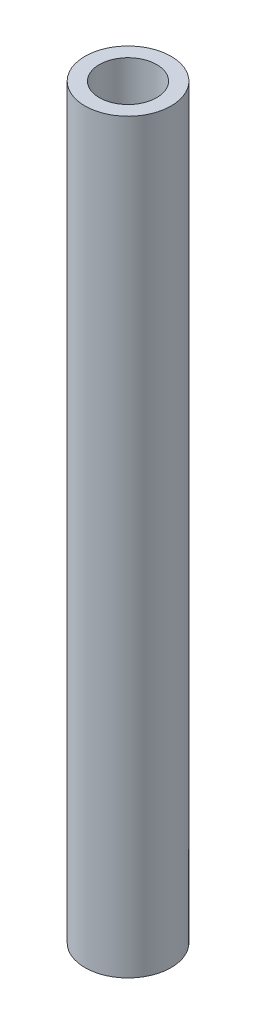
ISO-10303-21;
HEADER;
FILE_DESCRIPTION(('STEP AP214'),'2;1');
FILE_NAME('part.step','',(''),(''),'','','');
FILE_SCHEMA(('AUTOMOTIVE_DESIGN { 1 0 10303 214 1 1 1 1 }'));
ENDSEC;
DATA;
#1=APPLICATION_CONTEXT('core data for automotive mechanical design processes');
#2=APPLICATION_PROTOCOL_DEFINITION('international standard','automotive_design',2000,#1);
#3=PRODUCT_CONTEXT('',#1,'mechanical');
#4=PRODUCT('Part','Part','',(#3));
#5=PRODUCT_RELATED_PRODUCT_CATEGORY('part','',(#4));
#6=PRODUCT_DEFINITION_FORMATION('','',#4);
#7=PRODUCT_DEFINITION_CONTEXT('part definition',#1,'design');
#8=PRODUCT_DEFINITION('design','',#6,#7);
#9=PRODUCT_DEFINITION_SHAPE('','',#8);
#10=(LENGTH_UNIT() NAMED_UNIT(*) SI_UNIT(.MILLI.,.METRE.));
#11=(NAMED_UNIT(*) PLANE_ANGLE_UNIT() SI_UNIT($,.RADIAN.));
#12=(NAMED_UNIT(*) SI_UNIT($,.STERADIAN.) SOLID_ANGLE_UNIT());
#13=UNCERTAINTY_MEASURE_WITH_UNIT(LENGTH_MEASURE(1.E-05),#10,'distance_accuracy_value','');
#14=(GEOMETRIC_REPRESENTATION_CONTEXT(3) GLOBAL_UNCERTAINTY_ASSIGNED_CONTEXT((#13)) GLOBAL_UNIT_ASSIGNED_CONTEXT((#10,
#11,#12)) REPRESENTATION_CONTEXT('',''));
#15=CARTESIAN_POINT('',(0.,0.,0.));
#16=DIRECTION('',(0.,0.,1.));
#17=DIRECTION('',(1.,0.,0.));
#18=AXIS2_PLACEMENT_3D('',#15,#16,#17);
#19=CARTESIAN_POINT('',(0.,52.,0.));
#20=DIRECTION('',(0.,1.,0.));
#21=DIRECTION('',(0.,0.,1.));
#22=AXIS2_PLACEMENT_3D('',#19,#20,#21);
#23=PLANE('',#22);
#24=CARTESIAN_POINT('',(0.,52.,0.));
#25=DIRECTION('',(0.,1.,0.));
#26=DIRECTION('',(0.,0.,1.));
#27=AXIS2_PLACEMENT_3D('',#24,#25,#26);
#28=CIRCLE('',#27,3.);
#29=CARTESIAN_POINT('',(0.,52.,-3.));
#30=VERTEX_POINT('',#29);
#31=EDGE_CURVE('E10',#30,#30,#28,.T.);
#32=ORIENTED_EDGE('',*,*,#31,.T.);
#33=EDGE_LOOP('',(#32));
#34=FACE_BOUND('',#33,.T.);
#35=CARTESIAN_POINT('',(0.,52.,0.));
#36=DIRECTION('',(0.,1.,0.));
#37=DIRECTION('',(0.,0.,1.));
#38=AXIS2_PLACEMENT_3D('',#35,#36,#37);
#39=CIRCLE('',#38,2.);
#40=CARTESIAN_POINT('',(0.,52.,-2.));
#41=VERTEX_POINT('',#40);
#42=EDGE_CURVE('E56',#41,#41,#39,.T.);
#43=ORIENTED_EDGE('',*,*,#42,.F.);
#44=EDGE_LOOP('',(#43));
#45=FACE_BOUND('',#44,.T.);
#46=ADVANCED_FACE('F43',(#34,#45),#23,.T.);
#47=CARTESIAN_POINT('',(0.,0.,0.));
#48=DIRECTION('',(0.,1.,0.));
#49=DIRECTION('',(0.,0.,1.));
#50=AXIS2_PLACEMENT_3D('',#47,#48,#49);
#51=PLANE('',#50);
#52=CARTESIAN_POINT('',(0.,0.,0.));
#53=DIRECTION('',(0.,1.,0.));
#54=DIRECTION('',(0.,0.,1.));
#55=AXIS2_PLACEMENT_3D('',#52,#53,#54);
#56=CIRCLE('',#55,3.);
#57=CARTESIAN_POINT('',(0.,0.,-3.));
#58=VERTEX_POINT('',#57);
#59=EDGE_CURVE('E47',#58,#58,#56,.T.);
#60=ORIENTED_EDGE('',*,*,#59,.F.);
#61=EDGE_LOOP('',(#60));
#62=FACE_BOUND('',#61,.T.);
#63=CARTESIAN_POINT('',(0.,0.,0.));
#64=DIRECTION('',(0.,1.,0.));
#65=DIRECTION('',(0.,0.,1.));
#66=AXIS2_PLACEMENT_3D('',#63,#64,#65);
#67=CIRCLE('',#66,2.);
#68=CARTESIAN_POINT('',(0.,0.,-2.));
#69=VERTEX_POINT('',#68);
#70=EDGE_CURVE('E58',#69,#69,#67,.T.);
#71=ORIENTED_EDGE('',*,*,#70,.T.);
#72=EDGE_LOOP('',(#71));
#73=FACE_BOUND('',#72,.T.);
#74=ADVANCED_FACE('F70',(#62,#73),#51,.F.);
#75=CARTESIAN_POINT('',(0.,52.,0.));
#76=DIRECTION('',(0.,-1.,0.));
#77=DIRECTION('',(0.,0.,-1.));
#78=AXIS2_PLACEMENT_3D('',#75,#76,#77);
#79=CYLINDRICAL_SURFACE('',#78,3.);
#80=CARTESIAN_POINT('',(0.,52.,-3.));
#81=CARTESIAN_POINT('',(0.,51.4583333333333,-3.));
#82=CARTESIAN_POINT('',(0.,50.9166666666667,-3.));
#83=CARTESIAN_POINT('',(0.,49.8333333333333,-3.));
#84=CARTESIAN_POINT('',(0.,49.2916666666667,-3.));
#85=CARTESIAN_POINT('',(0.,48.2083333333333,-3.));
#86=CARTESIAN_POINT('',(0.,47.6666666666667,-3.));
#87=CARTESIAN_POINT('',(0.,46.5833333333333,-3.));
#88=CARTESIAN_POINT('',(0.,46.0416666666667,-3.));
#89=CARTESIAN_POINT('',(0.,44.9583333333333,-3.));
#90=CARTESIAN_POINT('',(0.,44.4166666666667,-3.));
#91=CARTESIAN_POINT('',(0.,43.3333333333333,-3.));
#92=CARTESIAN_POINT('',(0.,42.7916666666667,-3.));
#93=CARTESIAN_POINT('',(0.,41.7083333333333,-3.));
#94=CARTESIAN_POINT('',(0.,41.1666666666667,-3.));
#95=CARTESIAN_POINT('',(0.,40.0833333333333,-3.));
#96=CARTESIAN_POINT('',(0.,39.5416666666667,-3.));
#97=CARTESIAN_POINT('',(0.,38.4583333333333,-3.));
#98=CARTESIAN_POINT('',(0.,37.9166666666667,-3.));
#99=CARTESIAN_POINT('',(0.,36.8333333333333,-3.));
#100=CARTESIAN_POINT('',(0.,36.2916666666667,-3.));
#101=CARTESIAN_POINT('',(0.,35.2083333333333,-3.));
#102=CARTESIAN_POINT('',(0.,34.6666666666667,-3.));
#103=CARTESIAN_POINT('',(0.,33.5833333333333,-3.));
#104=CARTESIAN_POINT('',(0.,33.0416666666667,-3.));
#105=CARTESIAN_POINT('',(0.,31.9583333333333,-3.));
#106=CARTESIAN_POINT('',(0.,31.4166666666667,-3.));
#107=CARTESIAN_POINT('',(0.,30.3333333333333,-3.));
#108=CARTESIAN_POINT('',(0.,29.7916666666667,-3.));
#109=CARTESIAN_POINT('',(0.,28.7083333333333,-3.));
#110=CARTESIAN_POINT('',(0.,28.1666666666667,-3.));
#111=CARTESIAN_POINT('',(0.,27.0833333333333,-3.));
#112=CARTESIAN_POINT('',(0.,26.5416666666667,-3.));
#113=CARTESIAN_POINT('',(0.,25.4583333333333,-3.));
#114=CARTESIAN_POINT('',(0.,24.9166666666667,-3.));
#115=CARTESIAN_POINT('',(0.,23.8333333333333,-3.));
#116=CARTESIAN_POINT('',(0.,23.2916666666667,-3.));
#117=CARTESIAN_POINT('',(0.,22.2083333333333,-3.));
#118=CARTESIAN_POINT('',(0.,21.6666666666667,-3.));
#119=CARTESIAN_POINT('',(0.,20.5833333333333,-3.));
#120=CARTESIAN_POINT('',(0.,20.0416666666667,-3.));
#121=CARTESIAN_POINT('',(0.,18.9583333333333,-3.));
#122=CARTESIAN_POINT('',(0.,18.4166666666667,-3.));
#123=CARTESIAN_POINT('',(0.,17.3333333333333,-3.));
#124=CARTESIAN_POINT('',(0.,16.7916666666667,-3.));
#125=CARTESIAN_POINT('',(0.,15.7083333333333,-3.));
#126=CARTESIAN_POINT('',(0.,15.1666666666667,-3.));
#127=CARTESIAN_POINT('',(0.,14.0833333333333,-3.));
#128=CARTESIAN_POINT('',(0.,13.5416666666667,-3.));
#129=CARTESIAN_POINT('',(0.,12.4583333333333,-3.));
#130=CARTESIAN_POINT('',(0.,11.9166666666667,-3.));
#131=CARTESIAN_POINT('',(0.,10.8333333333333,-3.));
#132=CARTESIAN_POINT('',(0.,10.2916666666667,-3.));
#133=CARTESIAN_POINT('',(0.,9.20833333333333,-3.));
#134=CARTESIAN_POINT('',(0.,8.66666666666667,-3.));
#135=CARTESIAN_POINT('',(0.,7.58333333333333,-3.));
#136=CARTESIAN_POINT('',(0.,7.04166666666667,-3.));
#137=CARTESIAN_POINT('',(0.,5.95833333333333,-3.));
#138=CARTESIAN_POINT('',(0.,5.41666666666667,-3.));
#139=CARTESIAN_POINT('',(0.,4.33333333333333,-3.));
#140=CARTESIAN_POINT('',(0.,3.79166666666667,-3.));
#141=CARTESIAN_POINT('',(0.,2.70833333333334,-3.));
#142=CARTESIAN_POINT('',(0.,2.16666666666667,-3.));
#143=CARTESIAN_POINT('',(0.,1.08333333333333,-3.));
#144=CARTESIAN_POINT('',(0.,0.541666666666667,-3.));
#145=CARTESIAN_POINT('',(0.,0.,-3.));
#146=B_SPLINE_CURVE_WITH_KNOTS('',3,(#80,#81,#82,#83,#84,#85,#86,#87,#88,#89,#90,#91,#92,#93,
#94,#95,#96,#97,#98,#99,#100,#101,#102,#103,#104,#105,#106,#107,#108,#109,#110,#111,#112,#113,
#114,#115,#116,#117,#118,#119,#120,#121,#122,#123,#124,#125,#126,#127,#128,#129,#130,#131,#132,
#133,#134,#135,#136,#137,#138,#139,#140,#141,#142,#143,#144,#145),.UNSPECIFIED.,.F.,.F.,(4,2,2,
2,2,2,2,2,2,2,2,2,2,2,2,2,2,2,2,2,2,2,2,2,2,2,2,2,2,2,2,2,4),(0.,1.625,3.25,4.875,
6.50000000000001,8.125,9.75,11.375,13.,14.625,16.25,17.875,19.5,21.125,22.75,24.375,26.,27.625,
29.25,30.875,32.5,34.125,35.75,37.375,39.,40.625,42.25,43.875,45.5,47.125,48.75,50.375,52.),.UNSPECIFIED.);
#147=EDGE_CURVE('BSEAM45',#30,#58,#146,.T.);
#148=ORIENTED_EDGE('',*,*,#31,.F.);
#149=ORIENTED_EDGE('',*,*,#59,.T.);
#150=ORIENTED_EDGE('',*,*,#147,.T.);
#151=ORIENTED_EDGE('',*,*,#147,.F.);
#152=EDGE_LOOP('',(#148,#150,#149,#151));
#153=FACE_BOUND('',#152,.T.);
#154=ADVANCED_FACE('F45',(#153),#79,.T.);
#155=CARTESIAN_POINT('',(0.,52.,0.));
#156=DIRECTION('',(0.,-1.,0.));
#157=DIRECTION('',(0.,0.,-1.));
#158=AXIS2_PLACEMENT_3D('',#155,#156,#157);
#159=CYLINDRICAL_SURFACE('',#158,2.);
#160=CARTESIAN_POINT('',(0.,52.,-2.));
#161=CARTESIAN_POINT('',(0.,51.4583333333333,-2.));
#162=CARTESIAN_POINT('',(0.,50.9166666666667,-2.));
#163=CARTESIAN_POINT('',(0.,49.8333333333333,-2.));
#164=CARTESIAN_POINT('',(0.,49.2916666666667,-2.));
#165=CARTESIAN_POINT('',(0.,48.2083333333333,-2.));
#166=CARTESIAN_POINT('',(0.,47.6666666666667,-2.));
#167=CARTESIAN_POINT('',(0.,46.5833333333333,-2.));
#168=CARTESIAN_POINT('',(0.,46.0416666666667,-2.));
#169=CARTESIAN_POINT('',(0.,44.9583333333333,-2.));
#170=CARTESIAN_POINT('',(0.,44.4166666666667,-2.));
#171=CARTESIAN_POINT('',(0.,43.3333333333333,-2.));
#172=CARTESIAN_POINT('',(0.,42.7916666666667,-2.));
#173=CARTESIAN_POINT('',(0.,41.7083333333333,-2.));
#174=CARTESIAN_POINT('',(0.,41.1666666666667,-2.));
#175=CARTESIAN_POINT('',(0.,40.0833333333333,-2.));
#176=CARTESIAN_POINT('',(0.,39.5416666666667,-2.));
#177=CARTESIAN_POINT('',(0.,38.4583333333333,-2.));
#178=CARTESIAN_POINT('',(0.,37.9166666666667,-2.));
#179=CARTESIAN_POINT('',(0.,36.8333333333333,-2.));
#180=CARTESIAN_POINT('',(0.,36.2916666666667,-2.));
#181=CARTESIAN_POINT('',(0.,35.2083333333333,-2.));
#182=CARTESIAN_POINT('',(0.,34.6666666666667,-2.));
#183=CARTESIAN_POINT('',(0.,33.5833333333333,-2.));
#184=CARTESIAN_POINT('',(0.,33.0416666666667,-2.));
#185=CARTESIAN_POINT('',(0.,31.9583333333333,-2.));
#186=CARTESIAN_POINT('',(0.,31.4166666666667,-2.));
#187=CARTESIAN_POINT('',(0.,30.3333333333333,-2.));
#188=CARTESIAN_POINT('',(0.,29.7916666666667,-2.));
#189=CARTESIAN_POINT('',(0.,28.7083333333333,-2.));
#190=CARTESIAN_POINT('',(0.,28.1666666666667,-2.));
#191=CARTESIAN_POINT('',(0.,27.0833333333333,-2.));
#192=CARTESIAN_POINT('',(0.,26.5416666666667,-2.));
#193=CARTESIAN_POINT('',(0.,25.4583333333333,-2.));
#194=CARTESIAN_POINT('',(0.,24.9166666666667,-2.));
#195=CARTESIAN_POINT('',(0.,23.8333333333333,-2.));
#196=CARTESIAN_POINT('',(0.,23.2916666666667,-2.));
#197=CARTESIAN_POINT('',(0.,22.2083333333333,-2.));
#198=CARTESIAN_POINT('',(0.,21.6666666666667,-2.));
#199=CARTESIAN_POINT('',(0.,20.5833333333333,-2.));
#200=CARTESIAN_POINT('',(0.,20.0416666666667,-2.));
#201=CARTESIAN_POINT('',(0.,18.9583333333333,-2.));
#202=CARTESIAN_POINT('',(0.,18.4166666666667,-2.));
#203=CARTESIAN_POINT('',(0.,17.3333333333333,-2.));
#204=CARTESIAN_POINT('',(0.,16.7916666666667,-2.));
#205=CARTESIAN_POINT('',(0.,15.7083333333333,-2.));
#206=CARTESIAN_POINT('',(0.,15.1666666666667,-2.));
#207=CARTESIAN_POINT('',(0.,14.0833333333333,-2.));
#208=CARTESIAN_POINT('',(0.,13.5416666666667,-2.));
#209=CARTESIAN_POINT('',(0.,12.4583333333333,-2.));
#210=CARTESIAN_POINT('',(0.,11.9166666666667,-2.));
#211=CARTESIAN_POINT('',(0.,10.8333333333333,-2.));
#212=CARTESIAN_POINT('',(0.,10.2916666666667,-2.));
#213=CARTESIAN_POINT('',(0.,9.20833333333333,-2.));
#214=CARTESIAN_POINT('',(0.,8.66666666666667,-2.));
#215=CARTESIAN_POINT('',(0.,7.58333333333333,-2.));
#216=CARTESIAN_POINT('',(0.,7.04166666666667,-2.));
#217=CARTESIAN_POINT('',(0.,5.95833333333333,-2.));
#218=CARTESIAN_POINT('',(0.,5.41666666666667,-2.));
#219=CARTESIAN_POINT('',(0.,4.33333333333333,-2.));
#220=CARTESIAN_POINT('',(0.,3.79166666666667,-2.));
#221=CARTESIAN_POINT('',(0.,2.70833333333334,-2.));
#222=CARTESIAN_POINT('',(0.,2.16666666666667,-2.));
#223=CARTESIAN_POINT('',(0.,1.08333333333333,-2.));
#224=CARTESIAN_POINT('',(0.,0.541666666666667,-2.));
#225=CARTESIAN_POINT('',(0.,0.,-2.));
#226=B_SPLINE_CURVE_WITH_KNOTS('',3,(#160,#161,#162,#163,#164,#165,#166,#167,#168,#169,#170,
#171,#172,#173,#174,#175,#176,#177,#178,#179,#180,#181,#182,#183,#184,#185,#186,#187,#188,#189,
#190,#191,#192,#193,#194,#195,#196,#197,#198,#199,#200,#201,#202,#203,#204,#205,#206,#207,#208,
#209,#210,#211,#212,#213,#214,#215,#216,#217,#218,#219,#220,#221,#222,#223,#224,#225),
.UNSPECIFIED.,.F.,.F.,(4,2,2,2,2,2,2,2,2,2,2,2,2,2,2,2,2,2,2,2,2,2,2,2,2,2,2,2,2,2,2,2,4),(0.,
1.62499999999999,3.25,4.875,6.49999999999999,8.12499999999999,9.74999999999999,11.375,13.,
14.625,16.25,17.875,19.5,21.125,22.75,24.375,26.,27.625,29.25,30.875,32.5,34.125,35.75,37.375,
39.,40.625,42.25,43.875,45.5,47.125,48.75,50.375,52.),.UNSPECIFIED.);
#227=EDGE_CURVE('BSEAM66',#41,#69,#226,.T.);
#228=ORIENTED_EDGE('',*,*,#42,.T.);
#229=ORIENTED_EDGE('',*,*,#70,.F.);
#230=ORIENTED_EDGE('',*,*,#227,.T.);
#231=ORIENTED_EDGE('',*,*,#227,.F.);
#232=EDGE_LOOP('',(#228,#230,#229,#231));
#233=FACE_BOUND('',#232,.T.);
#234=ADVANCED_FACE('F66',(#233),#159,.F.);
#235=CLOSED_SHELL('',(#46,#74,#154,#234));
#236=MANIFOLD_SOLID_BREP('B2',#235);
#237=ADVANCED_BREP_SHAPE_REPRESENTATION('',(#18,#236),#14);
#238=SHAPE_DEFINITION_REPRESENTATION(#9,#237);
ENDSEC;
END-ISO-10303-21;
